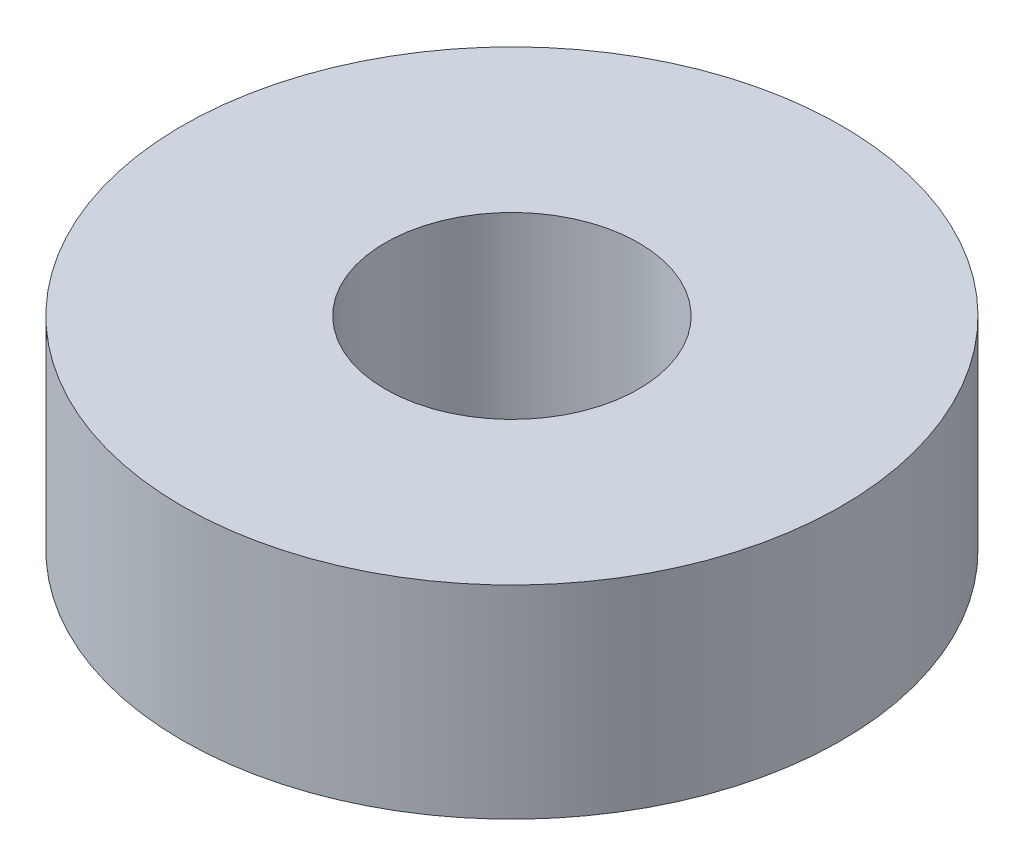
ISO-10303-21;
HEADER;
FILE_DESCRIPTION(('STEP AP214'),'2;1');
FILE_NAME('part.step','',(''),(''),'','','');
FILE_SCHEMA(('AUTOMOTIVE_DESIGN { 1 0 10303 214 1 1 1 1 }'));
ENDSEC;
DATA;
#1=APPLICATION_CONTEXT('core data for automotive mechanical design processes');
#2=APPLICATION_PROTOCOL_DEFINITION('international standard','automotive_design',2000,#1);
#3=PRODUCT_CONTEXT('',#1,'mechanical');
#4=PRODUCT('Part','Part','',(#3));
#5=PRODUCT_RELATED_PRODUCT_CATEGORY('part','',(#4));
#6=PRODUCT_DEFINITION_FORMATION('','',#4);
#7=PRODUCT_DEFINITION_CONTEXT('part definition',#1,'design');
#8=PRODUCT_DEFINITION('design','',#6,#7);
#9=PRODUCT_DEFINITION_SHAPE('','',#8);
#10=(LENGTH_UNIT() NAMED_UNIT(*) SI_UNIT(.MILLI.,.METRE.));
#11=(NAMED_UNIT(*) PLANE_ANGLE_UNIT() SI_UNIT($,.RADIAN.));
#12=(NAMED_UNIT(*) SI_UNIT($,.STERADIAN.) SOLID_ANGLE_UNIT());
#13=UNCERTAINTY_MEASURE_WITH_UNIT(LENGTH_MEASURE(1.E-05),#10,'distance_accuracy_value','');
#14=(GEOMETRIC_REPRESENTATION_CONTEXT(3) GLOBAL_UNCERTAINTY_ASSIGNED_CONTEXT((#13)) GLOBAL_UNIT_ASSIGNED_CONTEXT((#10,
#11,#12)) REPRESENTATION_CONTEXT('',''));
#15=CARTESIAN_POINT('',(0.,0.,0.));
#16=DIRECTION('',(0.,0.,1.));
#17=DIRECTION('',(1.,0.,0.));
#18=AXIS2_PLACEMENT_3D('',#15,#16,#17);
#19=CARTESIAN_POINT('',(0.,4.,0.));
#20=DIRECTION('',(0.,1.,0.));
#21=DIRECTION('',(0.,0.,1.));
#22=AXIS2_PLACEMENT_3D('',#19,#20,#21);
#23=PLANE('',#22);
#24=CARTESIAN_POINT('',(0.,4.,0.));
#25=DIRECTION('',(0.,1.,0.));
#26=DIRECTION('',(0.,0.,1.));
#27=AXIS2_PLACEMENT_3D('',#24,#25,#26);
#28=CIRCLE('',#27,6.5);
#29=CARTESIAN_POINT('',(0.,4.,6.5));
#30=VERTEX_POINT('',#29);
#31=EDGE_CURVE('E10',#30,#30,#28,.T.);
#32=ORIENTED_EDGE('',*,*,#31,.T.);
#33=EDGE_LOOP('',(#32));
#34=FACE_BOUND('',#33,.T.);
#35=CARTESIAN_POINT('',(0.,4.,0.));
#36=DIRECTION('',(0.,1.,0.));
#37=DIRECTION('',(0.,0.,1.));
#38=AXIS2_PLACEMENT_3D('',#35,#36,#37);
#39=CIRCLE('',#38,2.5);
#40=CARTESIAN_POINT('',(0.,4.,2.5));
#41=VERTEX_POINT('',#40);
#42=EDGE_CURVE('E42',#41,#41,#39,.T.);
#43=ORIENTED_EDGE('',*,*,#42,.F.);
#44=EDGE_LOOP('',(#43));
#45=FACE_BOUND('',#44,.T.);
#46=ADVANCED_FACE('F31',(#34,#45),#23,.T.);
#47=CARTESIAN_POINT('',(0.,0.,0.));
#48=DIRECTION('',(0.,1.,0.));
#49=DIRECTION('',(0.,0.,1.));
#50=AXIS2_PLACEMENT_3D('',#47,#48,#49);
#51=PLANE('',#50);
#52=CARTESIAN_POINT('',(0.,0.,0.));
#53=DIRECTION('',(0.,1.,0.));
#54=DIRECTION('',(0.,0.,1.));
#55=AXIS2_PLACEMENT_3D('',#52,#53,#54);
#56=CIRCLE('',#55,6.5);
#57=CARTESIAN_POINT('',(0.,0.,6.5));
#58=VERTEX_POINT('',#57);
#59=EDGE_CURVE('E35',#58,#58,#56,.T.);
#60=ORIENTED_EDGE('',*,*,#59,.F.);
#61=EDGE_LOOP('',(#60));
#62=FACE_BOUND('',#61,.T.);
#63=CARTESIAN_POINT('',(0.,0.,0.));
#64=DIRECTION('',(0.,1.,0.));
#65=DIRECTION('',(0.,0.,1.));
#66=AXIS2_PLACEMENT_3D('',#63,#64,#65);
#67=CIRCLE('',#66,2.5);
#68=CARTESIAN_POINT('',(0.,0.,2.5));
#69=VERTEX_POINT('',#68);
#70=EDGE_CURVE('E44',#69,#69,#67,.T.);
#71=ORIENTED_EDGE('',*,*,#70,.T.);
#72=EDGE_LOOP('',(#71));
#73=FACE_BOUND('',#72,.T.);
#74=ADVANCED_FACE('F54',(#62,#73),#51,.F.);
#75=CARTESIAN_POINT('',(0.,4.,0.));
#76=DIRECTION('',(0.,-1.,0.));
#77=DIRECTION('',(0.,0.,-1.));
#78=AXIS2_PLACEMENT_3D('',#75,#76,#77);
#79=CYLINDRICAL_SURFACE('',#78,6.5);
#80=ORIENTED_EDGE('',*,*,#31,.F.);
#81=EDGE_LOOP('',(#80));
#82=FACE_BOUND('',#81,.T.);
#83=ORIENTED_EDGE('',*,*,#59,.T.);
#84=EDGE_LOOP('',(#83));
#85=FACE_BOUND('',#84,.T.);
#86=ADVANCED_FACE('F33',(#82,#85),#79,.T.);
#87=CARTESIAN_POINT('',(0.,4.,0.));
#88=DIRECTION('',(0.,-1.,0.));
#89=DIRECTION('',(0.,0.,-1.));
#90=AXIS2_PLACEMENT_3D('',#87,#88,#89);
#91=CYLINDRICAL_SURFACE('',#90,2.5);
#92=ORIENTED_EDGE('',*,*,#42,.T.);
#93=EDGE_LOOP('',(#92));
#94=FACE_BOUND('',#93,.T.);
#95=ORIENTED_EDGE('',*,*,#70,.F.);
#96=EDGE_LOOP('',(#95));
#97=FACE_BOUND('',#96,.T.);
#98=ADVANCED_FACE('F50',(#94,#97),#91,.F.);
#99=CLOSED_SHELL('',(#46,#74,#86,#98));
#100=MANIFOLD_SOLID_BREP('B2',#99);
#101=ADVANCED_BREP_SHAPE_REPRESENTATION('',(#18,#100),#14);
#102=SHAPE_DEFINITION_REPRESENTATION(#9,#101);
ENDSEC;
END-ISO-10303-21;
